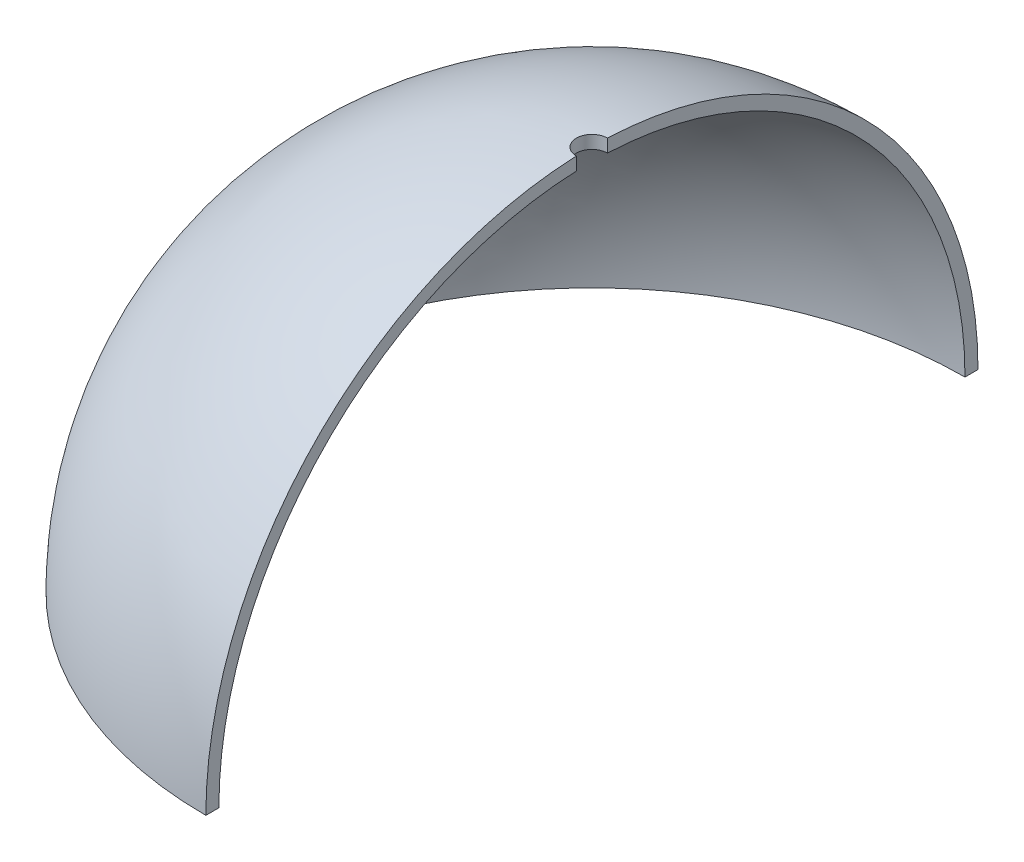
ISO-10303-21;
HEADER;
FILE_DESCRIPTION(('STEP AP214'),'2;1');
FILE_NAME('part.step','',(''),(''),'','','');
FILE_SCHEMA(('AUTOMOTIVE_DESIGN { 1 0 10303 214 1 1 1 1 }'));
ENDSEC;
DATA;
#1=APPLICATION_CONTEXT('core data for automotive mechanical design processes');
#2=APPLICATION_PROTOCOL_DEFINITION('international standard','automotive_design',2000,#1);
#3=PRODUCT_CONTEXT('',#1,'mechanical');
#4=PRODUCT('Part','Part','',(#3));
#5=PRODUCT_RELATED_PRODUCT_CATEGORY('part','',(#4));
#6=PRODUCT_DEFINITION_FORMATION('','',#4);
#7=PRODUCT_DEFINITION_CONTEXT('part definition',#1,'design');
#8=PRODUCT_DEFINITION('design','',#6,#7);
#9=PRODUCT_DEFINITION_SHAPE('','',#8);
#10=(LENGTH_UNIT() NAMED_UNIT(*) SI_UNIT(.MILLI.,.METRE.));
#11=(NAMED_UNIT(*) PLANE_ANGLE_UNIT() SI_UNIT($,.RADIAN.));
#12=(NAMED_UNIT(*) SI_UNIT($,.STERADIAN.) SOLID_ANGLE_UNIT());
#13=UNCERTAINTY_MEASURE_WITH_UNIT(LENGTH_MEASURE(1.E-05),#10,'distance_accuracy_value','');
#14=(GEOMETRIC_REPRESENTATION_CONTEXT(3) GLOBAL_UNCERTAINTY_ASSIGNED_CONTEXT((#13)) GLOBAL_UNIT_ASSIGNED_CONTEXT((#10,
#11,#12)) REPRESENTATION_CONTEXT('',''));
#15=CARTESIAN_POINT('',(0.,0.,0.));
#16=DIRECTION('',(0.,0.,1.));
#17=DIRECTION('',(1.,0.,0.));
#18=AXIS2_PLACEMENT_3D('',#15,#16,#17);
#19=CARTESIAN_POINT('',(0.,0.,0.));
#20=DIRECTION('',(0.,0.,1.));
#21=DIRECTION('',(0.,-1.,0.));
#22=AXIS2_PLACEMENT_3D('',#19,#20,#21);
#23=SPHERICAL_SURFACE('',#22,9610.);
#24=CARTESIAN_POINT('',(0.,9601.67172944379,0.));
#25=DIRECTION('',(0.,-1.,0.));
#26=DIRECTION('',(0.,0.,-1.));
#27=AXIS2_PLACEMENT_3D('',#24,#25,#26);
#28=CIRCLE('',#27,400.);
#29=CARTESIAN_POINT('',(3.35240576650507E-11,9601.67172944379,399.999999999962));
#30=VERTEX_POINT('',#29);
#31=CARTESIAN_POINT('',(0.,9601.67172944378,-400.));
#32=VERTEX_POINT('',#31);
#33=EDGE_CURVE('E61',#30,#32,#28,.T.);
#34=ORIENTED_EDGE('',*,*,#33,.F.);
#35=CARTESIAN_POINT('',(0.,0.,0.));
#36=DIRECTION('',(-1.,0.,0.));
#37=DIRECTION('',(0.,0.,1.));
#38=AXIS2_PLACEMENT_3D('',#35,#36,#37);
#39=CIRCLE('',#38,9610.);
#40=CARTESIAN_POINT('',(0.,0.,9610.));
#41=VERTEX_POINT('',#40);
#42=EDGE_CURVE('E114',#41,#30,#39,.T.);
#43=ORIENTED_EDGE('',*,*,#42,.F.);
#44=CARTESIAN_POINT('',(0.,0.,0.));
#45=DIRECTION('',(0.,-1.,0.));
#46=DIRECTION('',(0.,0.,1.));
#47=AXIS2_PLACEMENT_3D('',#44,#45,#46);
#48=CIRCLE('',#47,9610.);
#49=CARTESIAN_POINT('',(0.,0.,-9610.));
#50=VERTEX_POINT('',#49);
#51=EDGE_CURVE('E69',#41,#50,#48,.T.);
#52=ORIENTED_EDGE('',*,*,#51,.T.);
#53=EDGE_CURVE('E118',#32,#50,#39,.T.);
#54=ORIENTED_EDGE('',*,*,#53,.F.);
#55=EDGE_LOOP('',(#34,#43,#52,#54));
#56=FACE_BOUND('',#55,.T.);
#57=ADVANCED_FACE('F45',(#56),#23,.F.);
#58=CARTESIAN_POINT('',(0.,0.,0.));
#59=DIRECTION('',(0.,0.,1.));
#60=DIRECTION('',(0.,-1.,0.));
#61=AXIS2_PLACEMENT_3D('',#58,#59,#60);
#62=SPHERICAL_SURFACE('',#61,9945.);
#63=CARTESIAN_POINT('',(0.,9936.95250064123,0.));
#64=DIRECTION('',(0.,-1.,0.));
#65=DIRECTION('',(0.,0.,-1.));
#66=AXIS2_PLACEMENT_3D('',#63,#64,#65);
#67=CIRCLE('',#66,400.);
#68=CARTESIAN_POINT('',(3.46946842209595E-11,9936.95250064123,399.999999999989));
#69=VERTEX_POINT('',#68);
#70=CARTESIAN_POINT('',(3.46946842209595E-11,9936.95250064123,-399.999999999989));
#71=VERTEX_POINT('',#70);
#72=EDGE_CURVE('E88',#69,#71,#67,.T.);
#73=ORIENTED_EDGE('',*,*,#72,.T.);
#74=CARTESIAN_POINT('',(0.,0.,0.));
#75=DIRECTION('',(1.,0.,0.));
#76=DIRECTION('',(0.,0.,1.));
#77=AXIS2_PLACEMENT_3D('',#74,#75,#76);
#78=CIRCLE('',#77,9945.);
#79=CARTESIAN_POINT('',(0.,-1.21791124175204E-12,-9945.));
#80=VERTEX_POINT('',#79);
#81=EDGE_CURVE('E98',#80,#71,#78,.T.);
#82=ORIENTED_EDGE('',*,*,#81,.F.);
#83=CARTESIAN_POINT('',(0.,0.,0.));
#84=DIRECTION('',(0.,1.,0.));
#85=DIRECTION('',(0.,0.,1.));
#86=AXIS2_PLACEMENT_3D('',#83,#84,#85);
#87=CIRCLE('',#86,9945.);
#88=CARTESIAN_POINT('',(0.,0.,9945.));
#89=VERTEX_POINT('',#88);
#90=EDGE_CURVE('E119',#80,#89,#87,.T.);
#91=ORIENTED_EDGE('',*,*,#90,.T.);
#92=EDGE_CURVE('E99',#69,#89,#78,.T.);
#93=ORIENTED_EDGE('',*,*,#92,.F.);
#94=EDGE_LOOP('',(#73,#82,#91,#93));
#95=FACE_BOUND('',#94,.T.);
#96=ADVANCED_FACE('F47',(#95),#62,.T.);
#97=CARTESIAN_POINT('',(0.,0.,0.));
#98=DIRECTION('',(1.,0.,0.));
#99=DIRECTION('',(0.,0.,1.));
#100=AXIS2_PLACEMENT_3D('',#97,#98,#99);
#101=PLANE('',#100);
#102=ORIENTED_EDGE('',*,*,#42,.T.);
#103=DIRECTION('',(0.,-1.,0.));
#104=VECTOR('',#103,1.);
#105=CARTESIAN_POINT('',(3.47227854062763E-11,9945.001,400.));
#106=LINE('',#105,#104);
#107=EDGE_CURVE('E11',#30,#69,#106,.F.);
#108=ORIENTED_EDGE('',*,*,#107,.T.);
#109=ORIENTED_EDGE('',*,*,#92,.T.);
#110=DIRECTION('',(0.,0.,-1.));
#111=VECTOR('',#110,1.);
#112=CARTESIAN_POINT('',(0.,0.,9945.));
#113=LINE('',#112,#111);
#114=EDGE_CURVE('E93',#89,#41,#113,.T.);
#115=ORIENTED_EDGE('',*,*,#114,.T.);
#116=EDGE_LOOP('',(#102,#108,#109,#115));
#117=FACE_BOUND('',#116,.T.);
#118=ADVANCED_FACE('F129',(#117),#101,.T.);
#119=ORIENTED_EDGE('',*,*,#81,.T.);
#120=DIRECTION('',(0.,-1.,0.));
#121=VECTOR('',#120,1.);
#122=CARTESIAN_POINT('',(3.47227854062763E-11,9945.001,-400.));
#123=LINE('',#122,#121);
#124=EDGE_CURVE('E54',#71,#32,#123,.T.);
#125=ORIENTED_EDGE('',*,*,#124,.T.);
#126=ORIENTED_EDGE('',*,*,#53,.T.);
#127=DIRECTION('',(0.,0.,-1.));
#128=VECTOR('',#127,1.);
#129=CARTESIAN_POINT('',(0.,0.,-9610.));
#130=LINE('',#129,#128);
#131=EDGE_CURVE('E104',#50,#80,#130,.T.);
#132=ORIENTED_EDGE('',*,*,#131,.T.);
#133=EDGE_LOOP('',(#119,#125,#126,#132));
#134=FACE_BOUND('',#133,.T.);
#135=ADVANCED_FACE('F103',(#134),#101,.T.);
#136=CARTESIAN_POINT('',(0.,0.,0.));
#137=DIRECTION('',(0.,1.,0.));
#138=DIRECTION('',(0.,0.,1.));
#139=AXIS2_PLACEMENT_3D('',#136,#137,#138);
#140=PLANE('',#139);
#141=ORIENTED_EDGE('',*,*,#51,.F.);
#142=ORIENTED_EDGE('',*,*,#114,.F.);
#143=ORIENTED_EDGE('',*,*,#90,.F.);
#144=ORIENTED_EDGE('',*,*,#131,.F.);
#145=EDGE_LOOP('',(#141,#142,#143,#144));
#146=FACE_BOUND('',#145,.T.);
#147=ADVANCED_FACE('F127',(#146),#140,.F.);
#148=CARTESIAN_POINT('',(0.,9945.001,0.));
#149=DIRECTION('',(0.,-1.,0.));
#150=DIRECTION('',(0.,0.,-1.));
#151=AXIS2_PLACEMENT_3D('',#148,#149,#150);
#152=CYLINDRICAL_SURFACE('',#151,400.);
#153=ORIENTED_EDGE('',*,*,#33,.T.);
#154=ORIENTED_EDGE('',*,*,#124,.F.);
#155=ORIENTED_EDGE('',*,*,#72,.F.);
#156=ORIENTED_EDGE('',*,*,#107,.F.);
#157=EDGE_LOOP('',(#153,#154,#155,#156));
#158=FACE_BOUND('',#157,.T.);
#159=ADVANCED_FACE('F87',(#158),#152,.F.);
#160=CLOSED_SHELL('',(#57,#96,#118,#135,#147,#159));
#161=MANIFOLD_SOLID_BREP('B2',#160);
#162=ADVANCED_BREP_SHAPE_REPRESENTATION('',(#18,#161),#14);
#163=SHAPE_DEFINITION_REPRESENTATION(#9,#162);
ENDSEC;
END-ISO-10303-21;
